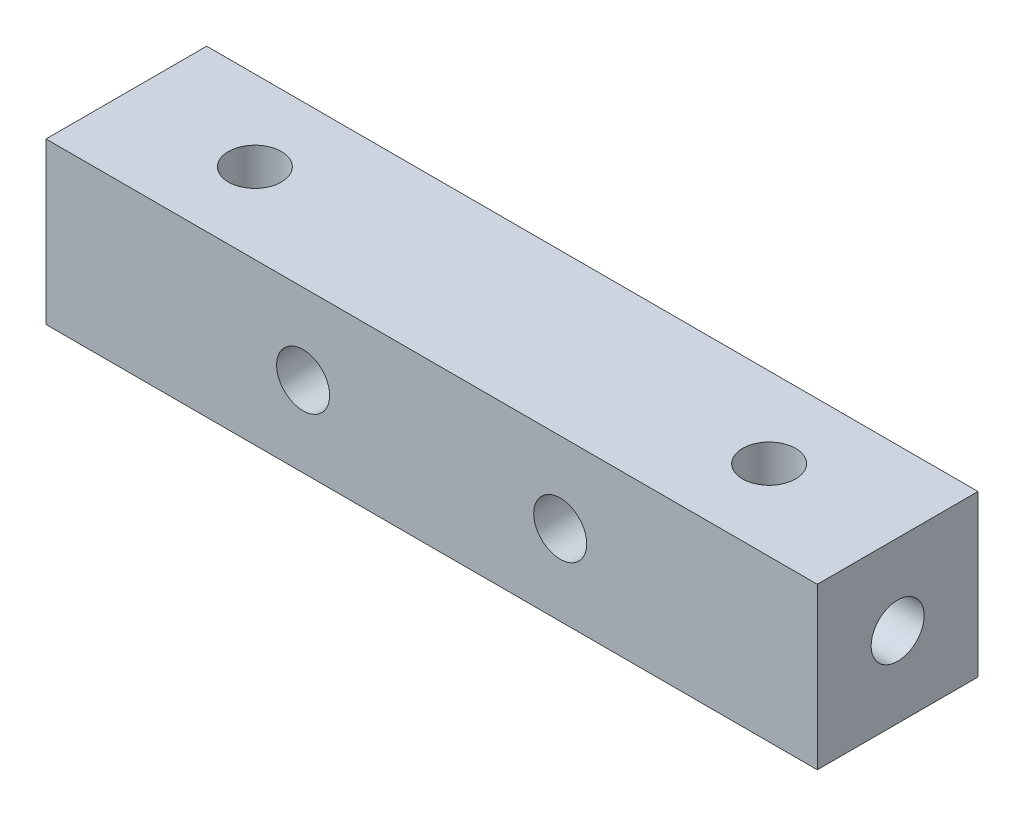
ISO-10303-21;
HEADER;
FILE_DESCRIPTION(('STEP AP214'),'2;1');
FILE_NAME('part.step','',(''),(''),'','','');
FILE_SCHEMA(('AUTOMOTIVE_DESIGN { 1 0 10303 214 1 1 1 1 }'));
ENDSEC;
DATA;
#1=APPLICATION_CONTEXT('core data for automotive mechanical design processes');
#2=APPLICATION_PROTOCOL_DEFINITION('international standard','automotive_design',2000,#1);
#3=PRODUCT_CONTEXT('',#1,'mechanical');
#4=PRODUCT('Part','Part','',(#3));
#5=PRODUCT_RELATED_PRODUCT_CATEGORY('part','',(#4));
#6=PRODUCT_DEFINITION_FORMATION('','',#4);
#7=PRODUCT_DEFINITION_CONTEXT('part definition',#1,'design');
#8=PRODUCT_DEFINITION('design','',#6,#7);
#9=PRODUCT_DEFINITION_SHAPE('','',#8);
#10=(LENGTH_UNIT() NAMED_UNIT(*) SI_UNIT(.MILLI.,.METRE.));
#11=(NAMED_UNIT(*) PLANE_ANGLE_UNIT() SI_UNIT($,.RADIAN.));
#12=(NAMED_UNIT(*) SI_UNIT($,.STERADIAN.) SOLID_ANGLE_UNIT());
#13=UNCERTAINTY_MEASURE_WITH_UNIT(LENGTH_MEASURE(1.E-05),#10,'distance_accuracy_value','');
#14=(GEOMETRIC_REPRESENTATION_CONTEXT(3) GLOBAL_UNCERTAINTY_ASSIGNED_CONTEXT((#13)) GLOBAL_UNIT_ASSIGNED_CONTEXT((#10,
#11,#12)) REPRESENTATION_CONTEXT('',''));
#15=CARTESIAN_POINT('',(0.,0.,0.));
#16=DIRECTION('',(0.,0.,1.));
#17=DIRECTION('',(1.,0.,0.));
#18=AXIS2_PLACEMENT_3D('',#15,#16,#17);
#19=CARTESIAN_POINT('',(-24.,0.,5.));
#20=DIRECTION('',(-1.,0.,0.));
#21=DIRECTION('',(0.,0.,1.));
#22=AXIS2_PLACEMENT_3D('',#19,#20,#21);
#23=CYLINDRICAL_SURFACE('',#22,1.64999999999999);
#24=CARTESIAN_POINT('',(-24.,0.,5.));
#25=DIRECTION('',(-1.,0.,0.));
#26=DIRECTION('',(0.,0.,1.));
#27=AXIS2_PLACEMENT_3D('',#24,#25,#26);
#28=CIRCLE('',#27,1.64999999999999);
#29=CARTESIAN_POINT('',(-24.,0.,6.64999999999999));
#30=VERTEX_POINT('',#29);
#31=EDGE_CURVE('E209',#30,#30,#28,.T.);
#32=ORIENTED_EDGE('',*,*,#31,.T.);
#33=EDGE_LOOP('',(#32));
#34=FACE_BOUND('',#33,.T.);
#35=CARTESIAN_POINT('',(-16.,0.,5.));
#36=DIRECTION('',(-0.707106781186547,-0.707106781186547,0.));
#37=DIRECTION('',(-0.707106781186547,0.707106781186547,0.));
#38=AXIS2_PLACEMENT_3D('',#35,#36,#37);
#39=ELLIPSE('',#38,2.3334523779156,1.64999999999999);
#40=CARTESIAN_POINT('',(-16.,0.,3.35000000000001));
#41=VERTEX_POINT('',#40);
#42=CARTESIAN_POINT('',(-16.,0.,6.64999999999999));
#43=VERTEX_POINT('',#42);
#44=EDGE_CURVE('E53',#41,#43,#39,.F.);
#45=ORIENTED_EDGE('',*,*,#44,.T.);
#46=CARTESIAN_POINT('',(-16.,0.,5.));
#47=DIRECTION('',(-0.707106781186547,0.707106781186547,0.));
#48=DIRECTION('',(-0.707106781186547,-0.707106781186547,0.));
#49=AXIS2_PLACEMENT_3D('',#46,#47,#48);
#50=ELLIPSE('',#49,2.3334523779156,1.64999999999999);
#51=EDGE_CURVE('E11',#43,#41,#50,.F.);
#52=ORIENTED_EDGE('',*,*,#51,.T.);
#53=EDGE_LOOP('',(#45,#52));
#54=FACE_BOUND('',#53,.T.);
#55=ADVANCED_FACE('F39',(#34,#54),#23,.F.);
#56=CARTESIAN_POINT('',(8.,0.,5.));
#57=DIRECTION('',(-0.707106781186547,0.,0.707106781186547));
#58=DIRECTION('',(-0.707106781186547,0.,-0.707106781186547));
#59=AXIS2_PLACEMENT_3D('',#56,#57,#58);
#60=ELLIPSE('',#59,2.3334523779156,1.64999999999999);
#61=CARTESIAN_POINT('',(8.,-1.65,5.));
#62=VERTEX_POINT('',#61);
#63=CARTESIAN_POINT('',(8.,1.64999999999999,5.));
#64=VERTEX_POINT('',#63);
#65=EDGE_CURVE('E156',#62,#64,#60,.T.);
#66=ORIENTED_EDGE('',*,*,#65,.T.);
#67=CARTESIAN_POINT('',(8.,0.,5.));
#68=DIRECTION('',(-0.707106781186547,0.,-0.707106781186547));
#69=DIRECTION('',(-0.707106781186547,0.,0.707106781186547));
#70=AXIS2_PLACEMENT_3D('',#67,#68,#69);
#71=ELLIPSE('',#70,2.3334523779156,1.64999999999999);
#72=EDGE_CURVE('E152',#64,#62,#71,.T.);
#73=ORIENTED_EDGE('',*,*,#72,.T.);
#74=EDGE_LOOP('',(#66,#73));
#75=FACE_BOUND('',#74,.T.);
#76=CARTESIAN_POINT('',(16.,0.,5.));
#77=DIRECTION('',(-0.707106781186547,-0.707106781186547,0.));
#78=DIRECTION('',(-0.707106781186547,0.707106781186547,0.));
#79=AXIS2_PLACEMENT_3D('',#76,#77,#78);
#80=ELLIPSE('',#79,2.3334523779156,1.64999999999999);
#81=CARTESIAN_POINT('',(16.,0.,3.35000000000001));
#82=VERTEX_POINT('',#81);
#83=CARTESIAN_POINT('',(16.,0.,6.64999999999999));
#84=VERTEX_POINT('',#83);
#85=EDGE_CURVE('E60',#82,#84,#80,.F.);
#86=ORIENTED_EDGE('',*,*,#85,.T.);
#87=CARTESIAN_POINT('',(16.,0.,5.));
#88=DIRECTION('',(-0.707106781186547,0.707106781186547,0.));
#89=DIRECTION('',(-0.707106781186547,-0.707106781186547,0.));
#90=AXIS2_PLACEMENT_3D('',#87,#88,#89);
#91=ELLIPSE('',#90,2.3334523779156,1.64999999999999);
#92=EDGE_CURVE('E115',#84,#82,#91,.F.);
#93=ORIENTED_EDGE('',*,*,#92,.T.);
#94=EDGE_LOOP('',(#86,#93));
#95=FACE_BOUND('',#94,.T.);
#96=ADVANCED_FACE('F280',(#75,#95),#23,.F.);
#97=CARTESIAN_POINT('',(-16.,0.,5.));
#98=DIRECTION('',(-0.707106781186547,-0.707106781186547,0.));
#99=DIRECTION('',(-0.707106781186547,0.707106781186547,0.));
#100=AXIS2_PLACEMENT_3D('',#97,#98,#99);
#101=ELLIPSE('',#100,2.3334523779156,1.64999999999999);
#102=EDGE_CURVE('E106',#41,#43,#101,.T.);
#103=ORIENTED_EDGE('',*,*,#102,.T.);
#104=CARTESIAN_POINT('',(-16.,0.,5.));
#105=DIRECTION('',(-0.707106781186547,0.707106781186547,0.));
#106=DIRECTION('',(-0.707106781186547,-0.707106781186547,0.));
#107=AXIS2_PLACEMENT_3D('',#104,#105,#106);
#108=ELLIPSE('',#107,2.3334523779156,1.64999999999999);
#109=EDGE_CURVE('E48',#43,#41,#108,.T.);
#110=ORIENTED_EDGE('',*,*,#109,.T.);
#111=EDGE_LOOP('',(#103,#110));
#112=FACE_BOUND('',#111,.T.);
#113=CARTESIAN_POINT('',(-8.,0.,5.));
#114=DIRECTION('',(-0.707106781186547,0.,0.707106781186547));
#115=DIRECTION('',(-0.707106781186547,0.,-0.707106781186547));
#116=AXIS2_PLACEMENT_3D('',#113,#114,#115);
#117=ELLIPSE('',#116,2.3334523779156,1.64999999999999);
#118=CARTESIAN_POINT('',(-8.,-1.65,5.));
#119=VERTEX_POINT('',#118);
#120=CARTESIAN_POINT('',(-8.,1.64999999999999,5.));
#121=VERTEX_POINT('',#120);
#122=EDGE_CURVE('E145',#119,#121,#117,.F.);
#123=ORIENTED_EDGE('',*,*,#122,.T.);
#124=CARTESIAN_POINT('',(-8.,0.,5.));
#125=DIRECTION('',(-0.707106781186547,0.,-0.707106781186547));
#126=DIRECTION('',(-0.707106781186547,0.,0.707106781186547));
#127=AXIS2_PLACEMENT_3D('',#124,#125,#126);
#128=ELLIPSE('',#127,2.3334523779156,1.64999999999999);
#129=EDGE_CURVE('E133',#121,#119,#128,.F.);
#130=ORIENTED_EDGE('',*,*,#129,.T.);
#131=EDGE_LOOP('',(#123,#130));
#132=FACE_BOUND('',#131,.T.);
#133=ADVANCED_FACE('F117',(#112,#132),#23,.F.);
#134=CARTESIAN_POINT('',(-8.,0.,5.));
#135=DIRECTION('',(-0.707106781186547,0.,0.707106781186547));
#136=DIRECTION('',(-0.707106781186547,0.,-0.707106781186547));
#137=AXIS2_PLACEMENT_3D('',#134,#135,#136);
#138=ELLIPSE('',#137,2.3334523779156,1.64999999999999);
#139=EDGE_CURVE('E141',#119,#121,#138,.T.);
#140=ORIENTED_EDGE('',*,*,#139,.T.);
#141=CARTESIAN_POINT('',(-8.,0.,5.));
#142=DIRECTION('',(-0.707106781186547,0.,-0.707106781186547));
#143=DIRECTION('',(-0.707106781186547,0.,0.707106781186547));
#144=AXIS2_PLACEMENT_3D('',#141,#142,#143);
#145=ELLIPSE('',#144,2.3334523779156,1.64999999999999);
#146=EDGE_CURVE('E137',#121,#119,#145,.T.);
#147=ORIENTED_EDGE('',*,*,#146,.T.);
#148=EDGE_LOOP('',(#140,#147));
#149=FACE_BOUND('',#148,.T.);
#150=CARTESIAN_POINT('',(8.,0.,5.));
#151=DIRECTION('',(-0.707106781186547,0.,0.707106781186547));
#152=DIRECTION('',(-0.707106781186547,0.,-0.707106781186547));
#153=AXIS2_PLACEMENT_3D('',#150,#151,#152);
#154=ELLIPSE('',#153,2.3334523779156,1.64999999999999);
#155=EDGE_CURVE('E160',#62,#64,#154,.F.);
#156=ORIENTED_EDGE('',*,*,#155,.T.);
#157=CARTESIAN_POINT('',(8.,0.,5.));
#158=DIRECTION('',(-0.707106781186547,0.,-0.707106781186547));
#159=DIRECTION('',(-0.707106781186547,0.,0.707106781186547));
#160=AXIS2_PLACEMENT_3D('',#157,#158,#159);
#161=ELLIPSE('',#160,2.3334523779156,1.64999999999999);
#162=EDGE_CURVE('E148',#64,#62,#161,.F.);
#163=ORIENTED_EDGE('',*,*,#162,.T.);
#164=EDGE_LOOP('',(#156,#163));
#165=FACE_BOUND('',#164,.T.);
#166=ADVANCED_FACE('F293',(#149,#165),#23,.F.);
#167=CARTESIAN_POINT('',(-24.,-5.00000000000001,10.));
#168=DIRECTION('',(1.,0.,0.));
#169=DIRECTION('',(0.,0.,-1.));
#170=AXIS2_PLACEMENT_3D('',#167,#168,#169);
#171=PLANE('',#170);
#172=ORIENTED_EDGE('',*,*,#31,.F.);
#173=EDGE_LOOP('',(#172));
#174=FACE_BOUND('',#173,.T.);
#175=DIRECTION('',(0.,-1.,0.));
#176=VECTOR('',#175,1.);
#177=CARTESIAN_POINT('',(-24.,-5.00000000000001,0.));
#178=LINE('',#177,#176);
#179=CARTESIAN_POINT('',(-24.,4.99999999999999,0.));
#180=VERTEX_POINT('',#179);
#181=CARTESIAN_POINT('',(-24.,-5.00000000000001,0.));
#182=VERTEX_POINT('',#181);
#183=EDGE_CURVE('E190',#180,#182,#178,.T.);
#184=ORIENTED_EDGE('',*,*,#183,.T.);
#185=DIRECTION('',(0.,0.,-1.));
#186=VECTOR('',#185,1.);
#187=CARTESIAN_POINT('',(-24.,-5.00000000000001,10.));
#188=LINE('',#187,#186);
#189=CARTESIAN_POINT('',(-24.,-5.00000000000001,10.));
#190=VERTEX_POINT('',#189);
#191=EDGE_CURVE('E163',#190,#182,#188,.T.);
#192=ORIENTED_EDGE('',*,*,#191,.F.);
#193=DIRECTION('',(0.,-1.,0.));
#194=VECTOR('',#193,1.);
#195=CARTESIAN_POINT('',(-24.,-5.00000000000001,10.));
#196=LINE('',#195,#194);
#197=CARTESIAN_POINT('',(-24.,4.99999999999999,10.));
#198=VERTEX_POINT('',#197);
#199=EDGE_CURVE('E183',#198,#190,#196,.T.);
#200=ORIENTED_EDGE('',*,*,#199,.F.);
#201=DIRECTION('',(0.,0.,-1.));
#202=VECTOR('',#201,1.);
#203=CARTESIAN_POINT('',(-24.,4.99999999999999,10.));
#204=LINE('',#203,#202);
#205=EDGE_CURVE('E175',#198,#180,#204,.T.);
#206=ORIENTED_EDGE('',*,*,#205,.T.);
#207=EDGE_LOOP('',(#184,#192,#200,#206));
#208=FACE_BOUND('',#207,.T.);
#209=ADVANCED_FACE('F41',(#174,#208),#171,.F.);
#210=CARTESIAN_POINT('',(24.,-5.,10.));
#211=DIRECTION('',(0.,1.,0.));
#212=DIRECTION('',(-1.,0.,0.));
#213=AXIS2_PLACEMENT_3D('',#210,#211,#212);
#214=PLANE('',#213);
#215=CARTESIAN_POINT('',(-16.,-5.00000000000001,5.));
#216=DIRECTION('',(0.,1.,0.));
#217=DIRECTION('',(0.,0.,1.));
#218=AXIS2_PLACEMENT_3D('',#215,#216,#217);
#219=CIRCLE('',#218,1.65);
#220=CARTESIAN_POINT('',(-16.,-5.00000000000001,6.65));
#221=VERTEX_POINT('',#220);
#222=EDGE_CURVE('E237',#221,#221,#219,.T.);
#223=ORIENTED_EDGE('',*,*,#222,.T.);
#224=EDGE_LOOP('',(#223));
#225=FACE_BOUND('',#224,.T.);
#226=CARTESIAN_POINT('',(16.,-5.00000000000001,5.));
#227=DIRECTION('',(0.,1.,0.));
#228=DIRECTION('',(0.,0.,1.));
#229=AXIS2_PLACEMENT_3D('',#226,#227,#228);
#230=CIRCLE('',#229,1.65);
#231=CARTESIAN_POINT('',(16.,-5.00000000000001,6.65));
#232=VERTEX_POINT('',#231);
#233=EDGE_CURVE('E229',#232,#232,#230,.T.);
#234=ORIENTED_EDGE('',*,*,#233,.T.);
#235=EDGE_LOOP('',(#234));
#236=FACE_BOUND('',#235,.T.);
#237=DIRECTION('',(1.,0.,0.));
#238=VECTOR('',#237,1.);
#239=CARTESIAN_POINT('',(24.,-5.,0.));
#240=LINE('',#239,#238);
#241=CARTESIAN_POINT('',(24.,-5.,0.));
#242=VERTEX_POINT('',#241);
#243=EDGE_CURVE('E187',#182,#242,#240,.T.);
#244=ORIENTED_EDGE('',*,*,#243,.T.);
#245=DIRECTION('',(0.,0.,-1.));
#246=VECTOR('',#245,1.);
#247=CARTESIAN_POINT('',(24.,-5.,10.));
#248=LINE('',#247,#246);
#249=CARTESIAN_POINT('',(24.,-5.,10.));
#250=VERTEX_POINT('',#249);
#251=EDGE_CURVE('E167',#250,#242,#248,.T.);
#252=ORIENTED_EDGE('',*,*,#251,.F.);
#253=DIRECTION('',(1.,0.,0.));
#254=VECTOR('',#253,1.);
#255=CARTESIAN_POINT('',(24.,-5.,10.));
#256=LINE('',#255,#254);
#257=EDGE_CURVE('E200',#190,#250,#256,.T.);
#258=ORIENTED_EDGE('',*,*,#257,.F.);
#259=ORIENTED_EDGE('',*,*,#191,.T.);
#260=EDGE_LOOP('',(#244,#252,#258,#259));
#261=FACE_BOUND('',#260,.T.);
#262=ADVANCED_FACE('F268',(#225,#236,#261),#214,.F.);
#263=CARTESIAN_POINT('',(24.,-5.,10.));
#264=DIRECTION('',(-1.,0.,0.));
#265=DIRECTION('',(0.,0.,1.));
#266=AXIS2_PLACEMENT_3D('',#263,#264,#265);
#267=PLANE('',#266);
#268=CARTESIAN_POINT('',(24.,0.,5.));
#269=DIRECTION('',(-1.,0.,0.));
#270=DIRECTION('',(0.,0.,1.));
#271=AXIS2_PLACEMENT_3D('',#268,#269,#270);
#272=CIRCLE('',#271,1.64999999999999);
#273=CARTESIAN_POINT('',(24.,0.,6.65));
#274=VERTEX_POINT('',#273);
#275=EDGE_CURVE('E194',#274,#274,#272,.T.);
#276=ORIENTED_EDGE('',*,*,#275,.T.);
#277=EDGE_LOOP('',(#276));
#278=FACE_BOUND('',#277,.T.);
#279=DIRECTION('',(0.,1.,0.));
#280=VECTOR('',#279,1.);
#281=CARTESIAN_POINT('',(24.,-5.,0.));
#282=LINE('',#281,#280);
#283=CARTESIAN_POINT('',(24.,5.,0.));
#284=VERTEX_POINT('',#283);
#285=EDGE_CURVE('E184',#242,#284,#282,.T.);
#286=ORIENTED_EDGE('',*,*,#285,.T.);
#287=DIRECTION('',(0.,0.,-1.));
#288=VECTOR('',#287,1.);
#289=CARTESIAN_POINT('',(24.,5.,10.));
#290=LINE('',#289,#288);
#291=CARTESIAN_POINT('',(24.,5.,10.));
#292=VERTEX_POINT('',#291);
#293=EDGE_CURVE('E171',#292,#284,#290,.T.);
#294=ORIENTED_EDGE('',*,*,#293,.F.);
#295=DIRECTION('',(0.,1.,0.));
#296=VECTOR('',#295,1.);
#297=CARTESIAN_POINT('',(24.,-5.,10.));
#298=LINE('',#297,#296);
#299=EDGE_CURVE('E197',#250,#292,#298,.T.);
#300=ORIENTED_EDGE('',*,*,#299,.F.);
#301=ORIENTED_EDGE('',*,*,#251,.T.);
#302=EDGE_LOOP('',(#286,#294,#300,#301));
#303=FACE_BOUND('',#302,.T.);
#304=ADVANCED_FACE('F251',(#278,#303),#267,.F.);
#305=CARTESIAN_POINT('',(24.,5.,10.));
#306=DIRECTION('',(0.,-1.,0.));
#307=DIRECTION('',(1.,0.,0.));
#308=AXIS2_PLACEMENT_3D('',#305,#306,#307);
#309=PLANE('',#308);
#310=CARTESIAN_POINT('',(-16.,5.,5.));
#311=DIRECTION('',(0.,1.,0.));
#312=DIRECTION('',(0.,0.,1.));
#313=AXIS2_PLACEMENT_3D('',#310,#311,#312);
#314=CIRCLE('',#313,1.64999999999999);
#315=CARTESIAN_POINT('',(-16.,5.,6.64999999999999));
#316=VERTEX_POINT('',#315);
#317=EDGE_CURVE('E241',#316,#316,#314,.T.);
#318=ORIENTED_EDGE('',*,*,#317,.F.);
#319=EDGE_LOOP('',(#318));
#320=FACE_BOUND('',#319,.T.);
#321=CARTESIAN_POINT('',(16.,5.,5.));
#322=DIRECTION('',(0.,1.,0.));
#323=DIRECTION('',(0.,0.,1.));
#324=AXIS2_PLACEMENT_3D('',#321,#322,#323);
#325=CIRCLE('',#324,1.64999999999999);
#326=CARTESIAN_POINT('',(16.,5.,6.64999999999999));
#327=VERTEX_POINT('',#326);
#328=EDGE_CURVE('E233',#327,#327,#325,.T.);
#329=ORIENTED_EDGE('',*,*,#328,.F.);
#330=EDGE_LOOP('',(#329));
#331=FACE_BOUND('',#330,.T.);
#332=DIRECTION('',(-1.,0.,0.));
#333=VECTOR('',#332,1.);
#334=CARTESIAN_POINT('',(24.,5.,0.));
#335=LINE('',#334,#333);
#336=EDGE_CURVE('E180',#284,#180,#335,.T.);
#337=ORIENTED_EDGE('',*,*,#336,.T.);
#338=ORIENTED_EDGE('',*,*,#205,.F.);
#339=DIRECTION('',(-1.,0.,0.));
#340=VECTOR('',#339,1.);
#341=CARTESIAN_POINT('',(24.,5.,10.));
#342=LINE('',#341,#340);
#343=EDGE_CURVE('E179',#292,#198,#342,.T.);
#344=ORIENTED_EDGE('',*,*,#343,.F.);
#345=ORIENTED_EDGE('',*,*,#293,.T.);
#346=EDGE_LOOP('',(#337,#338,#344,#345));
#347=FACE_BOUND('',#346,.T.);
#348=ADVANCED_FACE('F247',(#320,#331,#347),#309,.F.);
#349=CARTESIAN_POINT('',(0.,0.,10.));
#350=DIRECTION('',(0.,0.,1.));
#351=DIRECTION('',(1.,0.,0.));
#352=AXIS2_PLACEMENT_3D('',#349,#350,#351);
#353=PLANE('',#352);
#354=CARTESIAN_POINT('',(-8.,0.,10.));
#355=DIRECTION('',(0.,0.,-1.));
#356=DIRECTION('',(-1.,0.,0.));
#357=AXIS2_PLACEMENT_3D('',#354,#355,#356);
#358=CIRCLE('',#357,1.65);
#359=CARTESIAN_POINT('',(-9.65,0.,10.));
#360=VERTEX_POINT('',#359);
#361=EDGE_CURVE('E221',#360,#360,#358,.T.);
#362=ORIENTED_EDGE('',*,*,#361,.T.);
#363=EDGE_LOOP('',(#362));
#364=FACE_BOUND('',#363,.T.);
#365=CARTESIAN_POINT('',(8.,0.,10.));
#366=DIRECTION('',(0.,0.,-1.));
#367=DIRECTION('',(-1.,0.,0.));
#368=AXIS2_PLACEMENT_3D('',#365,#366,#367);
#369=CIRCLE('',#368,1.65);
#370=CARTESIAN_POINT('',(6.35,0.,10.));
#371=VERTEX_POINT('',#370);
#372=EDGE_CURVE('E213',#371,#371,#369,.T.);
#373=ORIENTED_EDGE('',*,*,#372,.T.);
#374=EDGE_LOOP('',(#373));
#375=FACE_BOUND('',#374,.T.);
#376=ORIENTED_EDGE('',*,*,#199,.T.);
#377=ORIENTED_EDGE('',*,*,#257,.T.);
#378=ORIENTED_EDGE('',*,*,#299,.T.);
#379=ORIENTED_EDGE('',*,*,#343,.T.);
#380=EDGE_LOOP('',(#376,#377,#378,#379));
#381=FACE_BOUND('',#380,.T.);
#382=ADVANCED_FACE('F250',(#364,#375,#381),#353,.T.);
#383=CARTESIAN_POINT('',(0.,0.,0.));
#384=DIRECTION('',(0.,0.,1.));
#385=DIRECTION('',(1.,0.,0.));
#386=AXIS2_PLACEMENT_3D('',#383,#384,#385);
#387=PLANE('',#386);
#388=CARTESIAN_POINT('',(-8.,0.,0.));
#389=DIRECTION('',(0.,0.,-1.));
#390=DIRECTION('',(-1.,0.,0.));
#391=AXIS2_PLACEMENT_3D('',#388,#389,#390);
#392=CIRCLE('',#391,1.64999999999999);
#393=CARTESIAN_POINT('',(-9.64999999999999,0.,0.));
#394=VERTEX_POINT('',#393);
#395=EDGE_CURVE('E225',#394,#394,#392,.T.);
#396=ORIENTED_EDGE('',*,*,#395,.F.);
#397=EDGE_LOOP('',(#396));
#398=FACE_BOUND('',#397,.T.);
#399=CARTESIAN_POINT('',(8.,0.,0.));
#400=DIRECTION('',(0.,0.,-1.));
#401=DIRECTION('',(-1.,0.,0.));
#402=AXIS2_PLACEMENT_3D('',#399,#400,#401);
#403=CIRCLE('',#402,1.64999999999999);
#404=CARTESIAN_POINT('',(6.35000000000001,0.,0.));
#405=VERTEX_POINT('',#404);
#406=EDGE_CURVE('E217',#405,#405,#403,.T.);
#407=ORIENTED_EDGE('',*,*,#406,.F.);
#408=EDGE_LOOP('',(#407));
#409=FACE_BOUND('',#408,.T.);
#410=ORIENTED_EDGE('',*,*,#183,.F.);
#411=ORIENTED_EDGE('',*,*,#336,.F.);
#412=ORIENTED_EDGE('',*,*,#285,.F.);
#413=ORIENTED_EDGE('',*,*,#243,.F.);
#414=EDGE_LOOP('',(#410,#411,#412,#413));
#415=FACE_BOUND('',#414,.T.);
#416=ADVANCED_FACE('F265',(#398,#409,#415),#387,.F.);
#417=CARTESIAN_POINT('',(16.,0.,5.));
#418=DIRECTION('',(-0.707106781186547,-0.707106781186547,0.));
#419=DIRECTION('',(-0.707106781186547,0.707106781186547,0.));
#420=AXIS2_PLACEMENT_3D('',#417,#418,#419);
#421=ELLIPSE('',#420,2.3334523779156,1.64999999999999);
#422=EDGE_CURVE('E127',#82,#84,#421,.T.);
#423=ORIENTED_EDGE('',*,*,#422,.T.);
#424=CARTESIAN_POINT('',(16.,0.,5.));
#425=DIRECTION('',(-0.707106781186547,0.707106781186547,0.));
#426=DIRECTION('',(-0.707106781186547,-0.707106781186547,0.));
#427=AXIS2_PLACEMENT_3D('',#424,#425,#426);
#428=ELLIPSE('',#427,2.3334523779156,1.64999999999999);
#429=EDGE_CURVE('E123',#84,#82,#428,.T.);
#430=ORIENTED_EDGE('',*,*,#429,.T.);
#431=EDGE_LOOP('',(#423,#430));
#432=FACE_BOUND('',#431,.T.);
#433=ORIENTED_EDGE('',*,*,#275,.F.);
#434=EDGE_LOOP('',(#433));
#435=FACE_BOUND('',#434,.T.);
#436=ADVANCED_FACE('F283',(#432,#435),#23,.F.);
#437=CARTESIAN_POINT('',(8.,0.,0.));
#438=DIRECTION('',(0.,0.,-1.));
#439=DIRECTION('',(-1.,0.,0.));
#440=AXIS2_PLACEMENT_3D('',#437,#438,#439);
#441=CYLINDRICAL_SURFACE('',#440,1.64999999999999);
#442=ORIENTED_EDGE('',*,*,#406,.T.);
#443=EDGE_LOOP('',(#442));
#444=FACE_BOUND('',#443,.T.);
#445=ORIENTED_EDGE('',*,*,#155,.F.);
#446=ORIENTED_EDGE('',*,*,#72,.F.);
#447=EDGE_LOOP('',(#445,#446));
#448=FACE_BOUND('',#447,.T.);
#449=ADVANCED_FACE('F291',(#444,#448),#441,.F.);
#450=ORIENTED_EDGE('',*,*,#372,.F.);
#451=EDGE_LOOP('',(#450));
#452=FACE_BOUND('',#451,.T.);
#453=ORIENTED_EDGE('',*,*,#65,.F.);
#454=ORIENTED_EDGE('',*,*,#162,.F.);
#455=EDGE_LOOP('',(#453,#454));
#456=FACE_BOUND('',#455,.T.);
#457=ADVANCED_FACE('F298',(#452,#456),#441,.F.);
#458=CARTESIAN_POINT('',(-8.,0.,0.));
#459=DIRECTION('',(0.,0.,-1.));
#460=DIRECTION('',(-1.,0.,0.));
#461=AXIS2_PLACEMENT_3D('',#458,#459,#460);
#462=CYLINDRICAL_SURFACE('',#461,1.64999999999999);
#463=ORIENTED_EDGE('',*,*,#395,.T.);
#464=EDGE_LOOP('',(#463));
#465=FACE_BOUND('',#464,.T.);
#466=ORIENTED_EDGE('',*,*,#122,.F.);
#467=ORIENTED_EDGE('',*,*,#146,.F.);
#468=EDGE_LOOP('',(#466,#467));
#469=FACE_BOUND('',#468,.T.);
#470=ADVANCED_FACE('F317',(#465,#469),#462,.F.);
#471=ORIENTED_EDGE('',*,*,#361,.F.);
#472=EDGE_LOOP('',(#471));
#473=FACE_BOUND('',#472,.T.);
#474=ORIENTED_EDGE('',*,*,#139,.F.);
#475=ORIENTED_EDGE('',*,*,#129,.F.);
#476=EDGE_LOOP('',(#474,#475));
#477=FACE_BOUND('',#476,.T.);
#478=ADVANCED_FACE('F322',(#473,#477),#462,.F.);
#479=CARTESIAN_POINT('',(16.,5.,5.));
#480=DIRECTION('',(0.,1.,0.));
#481=DIRECTION('',(0.,0.,1.));
#482=AXIS2_PLACEMENT_3D('',#479,#480,#481);
#483=CYLINDRICAL_SURFACE('',#482,1.64999999999999);
#484=ORIENTED_EDGE('',*,*,#328,.T.);
#485=EDGE_LOOP('',(#484));
#486=FACE_BOUND('',#485,.T.);
#487=ORIENTED_EDGE('',*,*,#85,.F.);
#488=ORIENTED_EDGE('',*,*,#429,.F.);
#489=EDGE_LOOP('',(#487,#488));
#490=FACE_BOUND('',#489,.T.);
#491=ADVANCED_FACE('F328',(#486,#490),#483,.F.);
#492=ORIENTED_EDGE('',*,*,#233,.F.);
#493=EDGE_LOOP('',(#492));
#494=FACE_BOUND('',#493,.T.);
#495=ORIENTED_EDGE('',*,*,#422,.F.);
#496=ORIENTED_EDGE('',*,*,#92,.F.);
#497=EDGE_LOOP('',(#495,#496));
#498=FACE_BOUND('',#497,.T.);
#499=ADVANCED_FACE('F330',(#494,#498),#483,.F.);
#500=CARTESIAN_POINT('',(-16.,4.99999999999999,5.));
#501=DIRECTION('',(0.,1.,0.));
#502=DIRECTION('',(0.,0.,1.));
#503=AXIS2_PLACEMENT_3D('',#500,#501,#502);
#504=CYLINDRICAL_SURFACE('',#503,1.64999999999999);
#505=ORIENTED_EDGE('',*,*,#317,.T.);
#506=EDGE_LOOP('',(#505));
#507=FACE_BOUND('',#506,.T.);
#508=ORIENTED_EDGE('',*,*,#44,.F.);
#509=ORIENTED_EDGE('',*,*,#109,.F.);
#510=EDGE_LOOP('',(#508,#509));
#511=FACE_BOUND('',#510,.T.);
#512=ADVANCED_FACE('F113',(#507,#511),#504,.F.);
#513=ORIENTED_EDGE('',*,*,#222,.F.);
#514=EDGE_LOOP('',(#513));
#515=FACE_BOUND('',#514,.T.);
#516=ORIENTED_EDGE('',*,*,#102,.F.);
#517=ORIENTED_EDGE('',*,*,#51,.F.);
#518=EDGE_LOOP('',(#516,#517));
#519=FACE_BOUND('',#518,.T.);
#520=ADVANCED_FACE('F107',(#515,#519),#504,.F.);
#521=CLOSED_SHELL('',(#55,#96,#133,#166,#209,#262,#304,#348,#382,#416,#436,#449,#457,#470,#478,
#491,#499,#512,#520));
#522=MANIFOLD_SOLID_BREP('B2',#521);
#523=ADVANCED_BREP_SHAPE_REPRESENTATION('',(#18,#522),#14);
#524=SHAPE_DEFINITION_REPRESENTATION(#9,#523);
ENDSEC;
END-ISO-10303-21;
